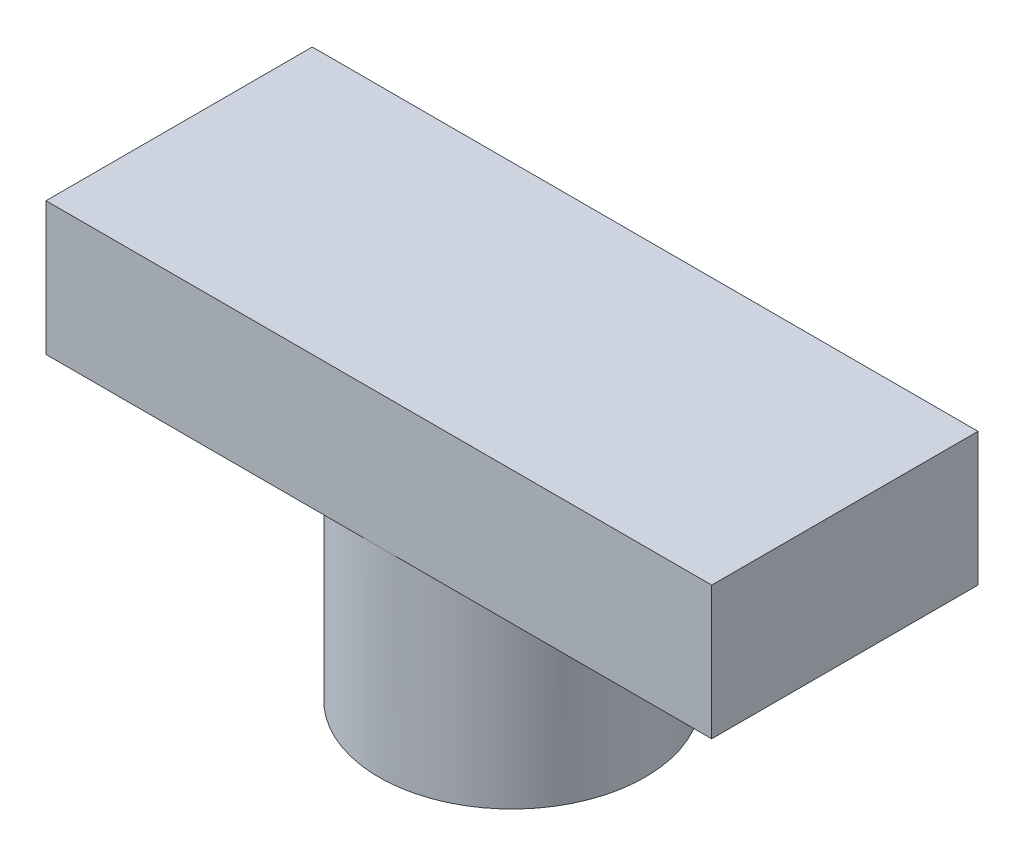
ISO-10303-21;
HEADER;
FILE_DESCRIPTION(('STEP AP214'),'2;1');
FILE_NAME('part.step','',(''),(''),'','','');
FILE_SCHEMA(('AUTOMOTIVE_DESIGN { 1 0 10303 214 1 1 1 1 }'));
ENDSEC;
DATA;
#1=APPLICATION_CONTEXT('core data for automotive mechanical design processes');
#2=APPLICATION_PROTOCOL_DEFINITION('international standard','automotive_design',2000,#1);
#3=PRODUCT_CONTEXT('',#1,'mechanical');
#4=PRODUCT('Part','Part','',(#3));
#5=PRODUCT_RELATED_PRODUCT_CATEGORY('part','',(#4));
#6=PRODUCT_DEFINITION_FORMATION('','',#4);
#7=PRODUCT_DEFINITION_CONTEXT('part definition',#1,'design');
#8=PRODUCT_DEFINITION('design','',#6,#7);
#9=PRODUCT_DEFINITION_SHAPE('','',#8);
#10=(LENGTH_UNIT() NAMED_UNIT(*) SI_UNIT(.MILLI.,.METRE.));
#11=(NAMED_UNIT(*) PLANE_ANGLE_UNIT() SI_UNIT($,.RADIAN.));
#12=(NAMED_UNIT(*) SI_UNIT($,.STERADIAN.) SOLID_ANGLE_UNIT());
#13=UNCERTAINTY_MEASURE_WITH_UNIT(LENGTH_MEASURE(1.E-05),#10,'distance_accuracy_value','');
#14=(GEOMETRIC_REPRESENTATION_CONTEXT(3) GLOBAL_UNCERTAINTY_ASSIGNED_CONTEXT((#13)) GLOBAL_UNIT_ASSIGNED_CONTEXT((#10,
#11,#12)) REPRESENTATION_CONTEXT('',''));
#15=CARTESIAN_POINT('',(0.,0.,0.));
#16=DIRECTION('',(0.,0.,1.));
#17=DIRECTION('',(1.,0.,0.));
#18=AXIS2_PLACEMENT_3D('',#15,#16,#17);
#19=CARTESIAN_POINT('',(0.,0.,0.));
#20=DIRECTION('',(0.,-1.,0.));
#21=DIRECTION('',(0.,0.,-1.));
#22=AXIS2_PLACEMENT_3D('',#19,#20,#21);
#23=PLANE('',#22);
#24=CARTESIAN_POINT('',(5.,0.,-2.));
#25=DIRECTION('',(0.,-1.,0.));
#26=DIRECTION('',(0.,0.,-1.));
#27=AXIS2_PLACEMENT_3D('',#24,#25,#26);
#28=CIRCLE('',#27,2.);
#29=CARTESIAN_POINT('',(5.,0.,-4.));
#30=VERTEX_POINT('',#29);
#31=CARTESIAN_POINT('',(5.,0.,0.));
#32=VERTEX_POINT('',#31);
#33=EDGE_CURVE('E47',#30,#32,#28,.T.);
#34=ORIENTED_EDGE('',*,*,#33,.F.);
#35=DIRECTION('',(-1.,0.,0.));
#36=VECTOR('',#35,1.);
#37=CARTESIAN_POINT('',(0.,0.,-4.));
#38=LINE('',#37,#36);
#39=CARTESIAN_POINT('',(10.,0.,-4.));
#40=VERTEX_POINT('',#39);
#41=EDGE_CURVE('E92',#40,#30,#38,.T.);
#42=ORIENTED_EDGE('',*,*,#41,.F.);
#43=DIRECTION('',(0.,0.,-1.));
#44=VECTOR('',#43,1.);
#45=CARTESIAN_POINT('',(10.,0.,0.));
#46=LINE('',#45,#44);
#47=CARTESIAN_POINT('',(10.,0.,0.));
#48=VERTEX_POINT('',#47);
#49=EDGE_CURVE('E105',#48,#40,#46,.T.);
#50=ORIENTED_EDGE('',*,*,#49,.F.);
#51=DIRECTION('',(1.,0.,0.));
#52=VECTOR('',#51,1.);
#53=CARTESIAN_POINT('',(0.,0.,0.));
#54=LINE('',#53,#52);
#55=EDGE_CURVE('E107',#32,#48,#54,.T.);
#56=ORIENTED_EDGE('',*,*,#55,.F.);
#57=EDGE_LOOP('',(#34,#42,#50,#56));
#58=FACE_BOUND('',#57,.T.);
#59=ADVANCED_FACE('F37',(#58),#23,.T.);
#60=CARTESIAN_POINT('',(0.,2.,0.));
#61=DIRECTION('',(1.,0.,0.));
#62=DIRECTION('',(0.,0.,-1.));
#63=AXIS2_PLACEMENT_3D('',#60,#61,#62);
#64=PLANE('',#63);
#65=DIRECTION('',(0.,0.,1.));
#66=VECTOR('',#65,1.);
#67=CARTESIAN_POINT('',(0.,0.,0.));
#68=LINE('',#67,#66);
#69=CARTESIAN_POINT('',(0.,0.,-4.));
#70=VERTEX_POINT('',#69);
#71=CARTESIAN_POINT('',(0.,0.,0.));
#72=VERTEX_POINT('',#71);
#73=EDGE_CURVE('E104',#70,#72,#68,.T.);
#74=ORIENTED_EDGE('',*,*,#73,.T.);
#75=DIRECTION('',(0.,-1.,0.));
#76=VECTOR('',#75,1.);
#77=CARTESIAN_POINT('',(0.,2.,0.));
#78=LINE('',#77,#76);
#79=CARTESIAN_POINT('',(0.,2.,0.));
#80=VERTEX_POINT('',#79);
#81=EDGE_CURVE('E41',#80,#72,#78,.T.);
#82=ORIENTED_EDGE('',*,*,#81,.F.);
#83=DIRECTION('',(0.,0.,1.));
#84=VECTOR('',#83,1.);
#85=CARTESIAN_POINT('',(0.,2.,0.));
#86=LINE('',#85,#84);
#87=CARTESIAN_POINT('',(0.,2.,-4.));
#88=VERTEX_POINT('',#87);
#89=EDGE_CURVE('E99',#88,#80,#86,.T.);
#90=ORIENTED_EDGE('',*,*,#89,.F.);
#91=DIRECTION('',(0.,-1.,0.));
#92=VECTOR('',#91,1.);
#93=CARTESIAN_POINT('',(0.,2.,-4.));
#94=LINE('',#93,#92);
#95=EDGE_CURVE('E149',#88,#70,#94,.T.);
#96=ORIENTED_EDGE('',*,*,#95,.T.);
#97=EDGE_LOOP('',(#74,#82,#90,#96));
#98=FACE_BOUND('',#97,.T.);
#99=ADVANCED_FACE('F39',(#98),#64,.F.);
#100=CARTESIAN_POINT('',(0.,2.,0.));
#101=DIRECTION('',(0.,0.,-1.));
#102=DIRECTION('',(-1.,0.,0.));
#103=AXIS2_PLACEMENT_3D('',#100,#101,#102);
#104=PLANE('',#103);
#105=EDGE_CURVE('E141',#72,#32,#54,.T.);
#106=ORIENTED_EDGE('',*,*,#105,.T.);
#107=ORIENTED_EDGE('',*,*,#55,.T.);
#108=DIRECTION('',(0.,-1.,0.));
#109=VECTOR('',#108,1.);
#110=CARTESIAN_POINT('',(10.,2.,0.));
#111=LINE('',#110,#109);
#112=CARTESIAN_POINT('',(10.,2.,0.));
#113=VERTEX_POINT('',#112);
#114=EDGE_CURVE('E151',#113,#48,#111,.T.);
#115=ORIENTED_EDGE('',*,*,#114,.F.);
#116=DIRECTION('',(1.,0.,0.));
#117=VECTOR('',#116,1.);
#118=CARTESIAN_POINT('',(0.,2.,0.));
#119=LINE('',#118,#117);
#120=EDGE_CURVE('E88',#80,#113,#119,.T.);
#121=ORIENTED_EDGE('',*,*,#120,.F.);
#122=ORIENTED_EDGE('',*,*,#81,.T.);
#123=EDGE_LOOP('',(#106,#107,#115,#121,#122));
#124=FACE_BOUND('',#123,.T.);
#125=ADVANCED_FACE('F130',(#124),#104,.F.);
#126=CARTESIAN_POINT('',(10.,2.,0.));
#127=DIRECTION('',(-1.,0.,0.));
#128=DIRECTION('',(0.,0.,1.));
#129=AXIS2_PLACEMENT_3D('',#126,#127,#128);
#130=PLANE('',#129);
#131=ORIENTED_EDGE('',*,*,#49,.T.);
#132=DIRECTION('',(0.,-1.,0.));
#133=VECTOR('',#132,1.);
#134=CARTESIAN_POINT('',(10.,2.,-4.));
#135=LINE('',#134,#133);
#136=CARTESIAN_POINT('',(10.,2.,-4.));
#137=VERTEX_POINT('',#136);
#138=EDGE_CURVE('E95',#137,#40,#135,.T.);
#139=ORIENTED_EDGE('',*,*,#138,.F.);
#140=DIRECTION('',(0.,0.,-1.));
#141=VECTOR('',#140,1.);
#142=CARTESIAN_POINT('',(10.,2.,0.));
#143=LINE('',#142,#141);
#144=EDGE_CURVE('E153',#113,#137,#143,.T.);
#145=ORIENTED_EDGE('',*,*,#144,.F.);
#146=ORIENTED_EDGE('',*,*,#114,.T.);
#147=EDGE_LOOP('',(#131,#139,#145,#146));
#148=FACE_BOUND('',#147,.T.);
#149=ADVANCED_FACE('F135',(#148),#130,.F.);
#150=CARTESIAN_POINT('',(0.,2.,-4.));
#151=DIRECTION('',(0.,0.,1.));
#152=DIRECTION('',(1.,0.,0.));
#153=AXIS2_PLACEMENT_3D('',#150,#151,#152);
#154=PLANE('',#153);
#155=ORIENTED_EDGE('',*,*,#41,.T.);
#156=EDGE_CURVE('E80',#30,#70,#38,.T.);
#157=ORIENTED_EDGE('',*,*,#156,.T.);
#158=ORIENTED_EDGE('',*,*,#95,.F.);
#159=DIRECTION('',(-1.,0.,0.));
#160=VECTOR('',#159,1.);
#161=CARTESIAN_POINT('',(0.,2.,-4.));
#162=LINE('',#161,#160);
#163=EDGE_CURVE('E61',#137,#88,#162,.T.);
#164=ORIENTED_EDGE('',*,*,#163,.F.);
#165=ORIENTED_EDGE('',*,*,#138,.T.);
#166=EDGE_LOOP('',(#155,#157,#158,#164,#165));
#167=FACE_BOUND('',#166,.T.);
#168=ADVANCED_FACE('F93',(#167),#154,.F.);
#169=CARTESIAN_POINT('',(0.,2.,0.));
#170=DIRECTION('',(0.,-1.,0.));
#171=DIRECTION('',(0.,0.,-1.));
#172=AXIS2_PLACEMENT_3D('',#169,#170,#171);
#173=PLANE('',#172);
#174=ORIENTED_EDGE('',*,*,#89,.T.);
#175=ORIENTED_EDGE('',*,*,#120,.T.);
#176=ORIENTED_EDGE('',*,*,#144,.T.);
#177=ORIENTED_EDGE('',*,*,#163,.T.);
#178=EDGE_LOOP('',(#174,#175,#176,#177));
#179=FACE_BOUND('',#178,.T.);
#180=ADVANCED_FACE('F122',(#179),#173,.F.);
#181=EDGE_CURVE('E11',#32,#30,#28,.T.);
#182=ORIENTED_EDGE('',*,*,#181,.F.);
#183=ORIENTED_EDGE('',*,*,#105,.F.);
#184=ORIENTED_EDGE('',*,*,#73,.F.);
#185=ORIENTED_EDGE('',*,*,#156,.F.);
#186=EDGE_LOOP('',(#182,#183,#184,#185));
#187=FACE_BOUND('',#186,.T.);
#188=ADVANCED_FACE('F102',(#187),#23,.T.);
#189=CARTESIAN_POINT('',(5.,-3.,-2.));
#190=DIRECTION('',(0.,1.,0.));
#191=DIRECTION('',(0.,0.,1.));
#192=AXIS2_PLACEMENT_3D('',#189,#190,#191);
#193=CYLINDRICAL_SURFACE('',#192,2.);
#194=CARTESIAN_POINT('',(5.,-3.,-2.));
#195=DIRECTION('',(0.,-1.,0.));
#196=DIRECTION('',(0.,0.,-1.));
#197=AXIS2_PLACEMENT_3D('',#194,#195,#196);
#198=CIRCLE('',#197,2.);
#199=CARTESIAN_POINT('',(5.,-3.,-4.));
#200=VERTEX_POINT('',#199);
#201=EDGE_CURVE('E110',#200,#200,#198,.T.);
#202=ORIENTED_EDGE('',*,*,#201,.F.);
#203=EDGE_LOOP('',(#202));
#204=FACE_BOUND('',#203,.T.);
#205=ORIENTED_EDGE('',*,*,#33,.T.);
#206=ORIENTED_EDGE('',*,*,#181,.T.);
#207=EDGE_LOOP('',(#205,#206));
#208=FACE_BOUND('',#207,.T.);
#209=ADVANCED_FACE('F111',(#204,#208),#193,.T.);
#210=CARTESIAN_POINT('',(5.,-3.,-2.));
#211=DIRECTION('',(0.,-1.,0.));
#212=DIRECTION('',(0.,0.,-1.));
#213=AXIS2_PLACEMENT_3D('',#210,#211,#212);
#214=PLANE('',#213);
#215=ORIENTED_EDGE('',*,*,#201,.T.);
#216=EDGE_LOOP('',(#215));
#217=FACE_BOUND('',#216,.T.);
#218=ADVANCED_FACE('F113',(#217),#214,.T.);
#219=CLOSED_SHELL('',(#59,#99,#125,#149,#168,#180,#188,#209,#218));
#220=MANIFOLD_SOLID_BREP('B2',#219);
#221=ADVANCED_BREP_SHAPE_REPRESENTATION('',(#18,#220),#14);
#222=SHAPE_DEFINITION_REPRESENTATION(#9,#221);
ENDSEC;
END-ISO-10303-21;
